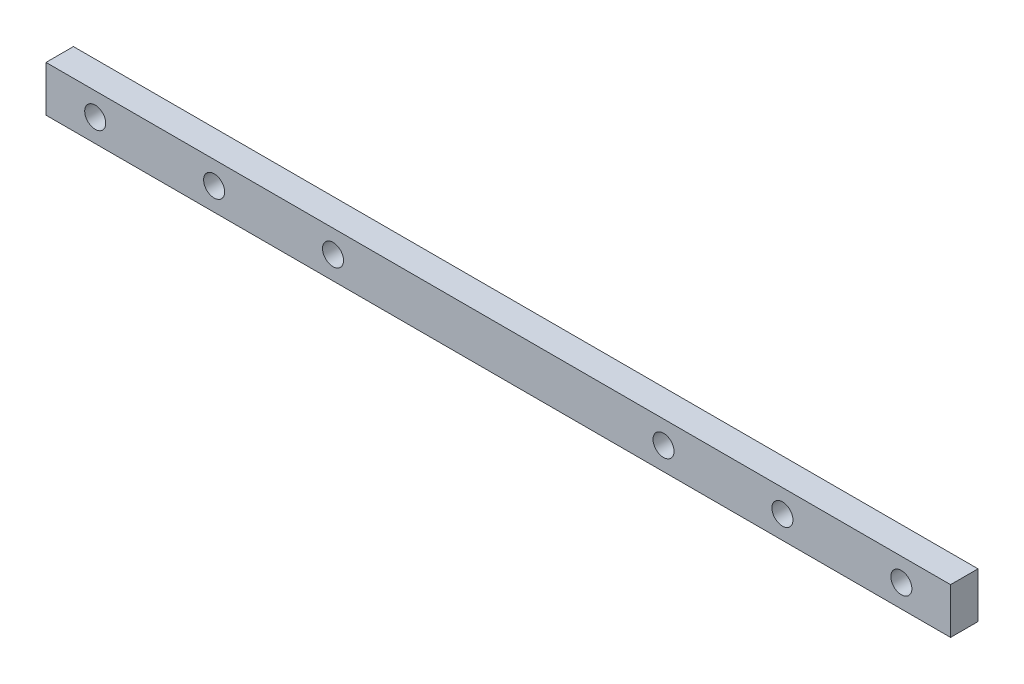
ISO-10303-21;
HEADER;
FILE_DESCRIPTION(('STEP AP214'),'2;1');
FILE_NAME('part.step','',(''),(''),'','','');
FILE_SCHEMA(('AUTOMOTIVE_DESIGN { 1 0 10303 214 1 1 1 1 }'));
ENDSEC;
DATA;
#1=APPLICATION_CONTEXT('core data for automotive mechanical design processes');
#2=APPLICATION_PROTOCOL_DEFINITION('international standard','automotive_design',2000,#1);
#3=PRODUCT_CONTEXT('',#1,'mechanical');
#4=PRODUCT('Part','Part','',(#3));
#5=PRODUCT_RELATED_PRODUCT_CATEGORY('part','',(#4));
#6=PRODUCT_DEFINITION_FORMATION('','',#4);
#7=PRODUCT_DEFINITION_CONTEXT('part definition',#1,'design');
#8=PRODUCT_DEFINITION('design','',#6,#7);
#9=PRODUCT_DEFINITION_SHAPE('','',#8);
#10=(LENGTH_UNIT() NAMED_UNIT(*) SI_UNIT(.MILLI.,.METRE.));
#11=(NAMED_UNIT(*) PLANE_ANGLE_UNIT() SI_UNIT($,.RADIAN.));
#12=(NAMED_UNIT(*) SI_UNIT($,.STERADIAN.) SOLID_ANGLE_UNIT());
#13=UNCERTAINTY_MEASURE_WITH_UNIT(LENGTH_MEASURE(1.E-05),#10,'distance_accuracy_value','');
#14=(GEOMETRIC_REPRESENTATION_CONTEXT(3) GLOBAL_UNCERTAINTY_ASSIGNED_CONTEXT((#13)) GLOBAL_UNIT_ASSIGNED_CONTEXT((#10,
#11,#12)) REPRESENTATION_CONTEXT('',''));
#15=CARTESIAN_POINT('',(0.,0.,0.));
#16=DIRECTION('',(0.,0.,1.));
#17=DIRECTION('',(1.,0.,0.));
#18=AXIS2_PLACEMENT_3D('',#15,#16,#17);
#19=CARTESIAN_POINT('',(-32.5,-20.885051312041,-14.0012634484264));
#20=DIRECTION('',(0.,-7.10399085631271E-05,0.999999997476666));
#21=DIRECTION('',(1.,0.,0.));
#22=AXIS2_PLACEMENT_3D('',#19,#20,#21);
#23=PLANE('',#22);
#24=CARTESIAN_POINT('',(-76.5679770448744,-20.885051312041,-14.0012634484264));
#25=DIRECTION('',(0.,7.10399085631271E-05,-0.999999997476666));
#26=DIRECTION('',(1.,0.,0.));
#27=AXIS2_PLACEMENT_3D('',#24,#25,#26);
#28=CIRCLE('',#27,1.15);
#29=CARTESIAN_POINT('',(-75.4179770448744,-20.885051312041,-14.0012634484264));
#30=VERTEX_POINT('',#29);
#31=EDGE_CURVE('E11',#30,#30,#28,.T.);
#32=ORIENTED_EDGE('',*,*,#31,.F.);
#33=EDGE_LOOP('',(#32));
#34=FACE_BOUND('',#33,.T.);
#35=CARTESIAN_POINT('',(-63.5679770448744,-20.885051312041,-14.0012634484264));
#36=DIRECTION('',(0.,7.10399085631271E-05,-0.999999997476666));
#37=DIRECTION('',(1.,0.,0.));
#38=AXIS2_PLACEMENT_3D('',#35,#36,#37);
#39=CIRCLE('',#38,1.15);
#40=CARTESIAN_POINT('',(-62.4179770448744,-20.885051312041,-14.0012634484264));
#41=VERTEX_POINT('',#40);
#42=EDGE_CURVE('E24',#41,#41,#39,.T.);
#43=ORIENTED_EDGE('',*,*,#42,.F.);
#44=EDGE_LOOP('',(#43));
#45=FACE_BOUND('',#44,.T.);
#46=CARTESIAN_POINT('',(-50.5679770448744,-20.885051312041,-14.0012634484264));
#47=DIRECTION('',(0.,7.10399085631271E-05,-0.999999997476666));
#48=DIRECTION('',(1.,0.,0.));
#49=AXIS2_PLACEMENT_3D('',#46,#47,#48);
#50=CIRCLE('',#49,1.15);
#51=CARTESIAN_POINT('',(-49.4179770448744,-20.885051312041,-14.0012634484264));
#52=VERTEX_POINT('',#51);
#53=EDGE_CURVE('E141',#52,#52,#50,.T.);
#54=ORIENTED_EDGE('',*,*,#53,.F.);
#55=EDGE_LOOP('',(#54));
#56=FACE_BOUND('',#55,.T.);
#57=CARTESIAN_POINT('',(11.5679770448743,-20.885051312041,-14.0012634484264));
#58=DIRECTION('',(0.,7.10399085631271E-05,-0.999999997476666));
#59=DIRECTION('',(1.,0.,0.));
#60=AXIS2_PLACEMENT_3D('',#57,#58,#59);
#61=CIRCLE('',#60,1.15);
#62=CARTESIAN_POINT('',(12.7179770448743,-20.885051312041,-14.0012634484264));
#63=VERTEX_POINT('',#62);
#64=EDGE_CURVE('E138',#63,#63,#61,.T.);
#65=ORIENTED_EDGE('',*,*,#64,.F.);
#66=EDGE_LOOP('',(#65));
#67=FACE_BOUND('',#66,.T.);
#68=CARTESIAN_POINT('',(-1.43202295512565,-20.885051312041,-14.0012634484264));
#69=DIRECTION('',(0.,7.10399085631271E-05,-0.999999997476666));
#70=DIRECTION('',(1.,0.,0.));
#71=AXIS2_PLACEMENT_3D('',#68,#69,#70);
#72=CIRCLE('',#71,1.15);
#73=CARTESIAN_POINT('',(-0.282022955125652,-20.885051312041,-14.0012634484264));
#74=VERTEX_POINT('',#73);
#75=EDGE_CURVE('E135',#74,#74,#72,.T.);
#76=ORIENTED_EDGE('',*,*,#75,.F.);
#77=EDGE_LOOP('',(#76));
#78=FACE_BOUND('',#77,.T.);
#79=CARTESIAN_POINT('',(-14.4320229551257,-20.885051312041,-14.0012634484264));
#80=DIRECTION('',(0.,7.10399085631271E-05,-0.999999997476666));
#81=DIRECTION('',(1.,0.,0.));
#82=AXIS2_PLACEMENT_3D('',#79,#80,#81);
#83=CIRCLE('',#82,1.15);
#84=CARTESIAN_POINT('',(-13.2820229551257,-20.885051312041,-14.0012634484264));
#85=VERTEX_POINT('',#84);
#86=EDGE_CURVE('E130',#85,#85,#83,.T.);
#87=ORIENTED_EDGE('',*,*,#86,.F.);
#88=EDGE_LOOP('',(#87));
#89=FACE_BOUND('',#88,.T.);
#90=DIRECTION('',(0.,-0.999999997476666,-7.10399085631271E-05));
#91=VECTOR('',#90,1.);
#92=CARTESIAN_POINT('',(-81.9499999776483,-18.3850513183523,-14.001085848655));
#93=LINE('',#92,#91);
#94=CARTESIAN_POINT('',(-81.9499999776483,-18.3850513183523,-14.001085848655));
#95=VERTEX_POINT('',#94);
#96=CARTESIAN_POINT('',(-81.9499999776483,-23.3850513057297,-14.0014410481978));
#97=VERTEX_POINT('',#96);
#98=EDGE_CURVE('E31',#95,#97,#93,.T.);
#99=ORIENTED_EDGE('',*,*,#98,.F.);
#100=DIRECTION('',(-1.,0.,0.));
#101=VECTOR('',#100,1.);
#102=CARTESIAN_POINT('',(16.9499999776483,-18.3850513183523,-14.001085848655));
#103=LINE('',#102,#101);
#104=CARTESIAN_POINT('',(16.9499999776483,-18.3850513183523,-14.001085848655));
#105=VERTEX_POINT('',#104);
#106=EDGE_CURVE('E36',#105,#95,#103,.T.);
#107=ORIENTED_EDGE('',*,*,#106,.F.);
#108=DIRECTION('',(0.,0.999999997476666,7.10399085620774E-05));
#109=VECTOR('',#108,1.);
#110=CARTESIAN_POINT('',(16.9499999776483,-23.3850513057296,-14.0014410481978));
#111=LINE('',#110,#109);
#112=CARTESIAN_POINT('',(16.9499999776483,-23.3850513057296,-14.0014410481978));
#113=VERTEX_POINT('',#112);
#114=EDGE_CURVE('E120',#113,#105,#111,.T.);
#115=ORIENTED_EDGE('',*,*,#114,.F.);
#116=DIRECTION('',(1.,0.,0.));
#117=VECTOR('',#116,1.);
#118=CARTESIAN_POINT('',(-81.9499999776483,-23.3850513057296,-14.0014410481978));
#119=LINE('',#118,#117);
#120=EDGE_CURVE('E117',#97,#113,#119,.T.);
#121=ORIENTED_EDGE('',*,*,#120,.F.);
#122=EDGE_LOOP('',(#99,#107,#115,#121));
#123=FACE_BOUND('',#122,.T.);
#124=ADVANCED_FACE('F17',(#34,#45,#56,#67,#78,#89,#123),#23,.F.);
#125=CARTESIAN_POINT('',(-32.5,-20.8852644317667,-11.0012634559964));
#126=DIRECTION('',(0.,-7.10399085631271E-05,0.999999997476666));
#127=DIRECTION('',(1.,0.,0.));
#128=AXIS2_PLACEMENT_3D('',#125,#126,#127);
#129=PLANE('',#128);
#130=CARTESIAN_POINT('',(-76.5679770448744,-20.8852644317667,-11.0012634559964));
#131=DIRECTION('',(0.,7.10399085631271E-05,-0.999999997476666));
#132=DIRECTION('',(1.,0.,0.));
#133=AXIS2_PLACEMENT_3D('',#130,#131,#132);
#134=CIRCLE('',#133,1.15);
#135=CARTESIAN_POINT('',(-75.4179770448744,-20.8852644317667,-11.0012634559964));
#136=VERTEX_POINT('',#135);
#137=EDGE_CURVE('E114',#136,#136,#134,.T.);
#138=ORIENTED_EDGE('',*,*,#137,.T.);
#139=EDGE_LOOP('',(#138));
#140=FACE_BOUND('',#139,.T.);
#141=CARTESIAN_POINT('',(-63.5679770448744,-20.8852644317667,-11.0012634559964));
#142=DIRECTION('',(0.,7.10399085631271E-05,-0.999999997476666));
#143=DIRECTION('',(1.,0.,0.));
#144=AXIS2_PLACEMENT_3D('',#141,#142,#143);
#145=CIRCLE('',#144,1.15);
#146=CARTESIAN_POINT('',(-62.4179770448744,-20.8852644317667,-11.0012634559964));
#147=VERTEX_POINT('',#146);
#148=EDGE_CURVE('E111',#147,#147,#145,.T.);
#149=ORIENTED_EDGE('',*,*,#148,.T.);
#150=EDGE_LOOP('',(#149));
#151=FACE_BOUND('',#150,.T.);
#152=CARTESIAN_POINT('',(-50.5679770448744,-20.8852644317667,-11.0012634559964));
#153=DIRECTION('',(0.,7.10399085631271E-05,-0.999999997476666));
#154=DIRECTION('',(1.,0.,0.));
#155=AXIS2_PLACEMENT_3D('',#152,#153,#154);
#156=CIRCLE('',#155,1.15);
#157=CARTESIAN_POINT('',(-49.4179770448744,-20.8852644317667,-11.0012634559964));
#158=VERTEX_POINT('',#157);
#159=EDGE_CURVE('E108',#158,#158,#156,.T.);
#160=ORIENTED_EDGE('',*,*,#159,.T.);
#161=EDGE_LOOP('',(#160));
#162=FACE_BOUND('',#161,.T.);
#163=CARTESIAN_POINT('',(11.5679770448743,-20.8852644317667,-11.0012634559964));
#164=DIRECTION('',(0.,7.10399085631271E-05,-0.999999997476666));
#165=DIRECTION('',(1.,0.,0.));
#166=AXIS2_PLACEMENT_3D('',#163,#164,#165);
#167=CIRCLE('',#166,1.15);
#168=CARTESIAN_POINT('',(12.7179770448743,-20.8852644317667,-11.0012634559964));
#169=VERTEX_POINT('',#168);
#170=EDGE_CURVE('E105',#169,#169,#167,.T.);
#171=ORIENTED_EDGE('',*,*,#170,.T.);
#172=EDGE_LOOP('',(#171));
#173=FACE_BOUND('',#172,.T.);
#174=CARTESIAN_POINT('',(-1.43202295512565,-20.8852644317667,-11.0012634559964));
#175=DIRECTION('',(0.,7.10399085631271E-05,-0.999999997476666));
#176=DIRECTION('',(1.,0.,0.));
#177=AXIS2_PLACEMENT_3D('',#174,#175,#176);
#178=CIRCLE('',#177,1.15);
#179=CARTESIAN_POINT('',(-0.28202295512565,-20.8852644317667,-11.0012634559964));
#180=VERTEX_POINT('',#179);
#181=EDGE_CURVE('E102',#180,#180,#178,.T.);
#182=ORIENTED_EDGE('',*,*,#181,.T.);
#183=EDGE_LOOP('',(#182));
#184=FACE_BOUND('',#183,.T.);
#185=CARTESIAN_POINT('',(-14.4320229551257,-20.8852644317667,-11.0012634559964));
#186=DIRECTION('',(0.,7.10399085631271E-05,-0.999999997476666));
#187=DIRECTION('',(1.,0.,0.));
#188=AXIS2_PLACEMENT_3D('',#185,#186,#187);
#189=CIRCLE('',#188,1.15);
#190=CARTESIAN_POINT('',(-13.2820229551257,-20.8852644317667,-11.0012634559964));
#191=VERTEX_POINT('',#190);
#192=EDGE_CURVE('E73',#191,#191,#189,.T.);
#193=ORIENTED_EDGE('',*,*,#192,.T.);
#194=EDGE_LOOP('',(#193));
#195=FACE_BOUND('',#194,.T.);
#196=DIRECTION('',(0.,-0.999999997476666,-7.10399085631271E-05));
#197=VECTOR('',#196,1.);
#198=CARTESIAN_POINT('',(-81.9499999776483,-18.385264438078,-11.001085856225));
#199=LINE('',#198,#197);
#200=CARTESIAN_POINT('',(-81.9499999776483,-18.385264438078,-11.001085856225));
#201=VERTEX_POINT('',#200);
#202=CARTESIAN_POINT('',(-81.9499999776483,-23.3852644254554,-11.0014410557678));
#203=VERTEX_POINT('',#202);
#204=EDGE_CURVE('E58',#201,#203,#199,.T.);
#205=ORIENTED_EDGE('',*,*,#204,.T.);
#206=DIRECTION('',(1.,0.,0.));
#207=VECTOR('',#206,1.);
#208=CARTESIAN_POINT('',(-81.9499999776483,-23.3852644254553,-11.0014410557678));
#209=LINE('',#208,#207);
#210=CARTESIAN_POINT('',(16.9499999776483,-23.3852644254553,-11.0014410557678));
#211=VERTEX_POINT('',#210);
#212=EDGE_CURVE('E74',#203,#211,#209,.T.);
#213=ORIENTED_EDGE('',*,*,#212,.T.);
#214=DIRECTION('',(0.,0.999999997476666,7.10399085620774E-05));
#215=VECTOR('',#214,1.);
#216=CARTESIAN_POINT('',(16.9499999776483,-23.3852644254553,-11.0014410557678));
#217=LINE('',#216,#215);
#218=CARTESIAN_POINT('',(16.9499999776483,-18.385264438078,-11.001085856225));
#219=VERTEX_POINT('',#218);
#220=EDGE_CURVE('E61',#211,#219,#217,.T.);
#221=ORIENTED_EDGE('',*,*,#220,.T.);
#222=DIRECTION('',(-1.,0.,0.));
#223=VECTOR('',#222,1.);
#224=CARTESIAN_POINT('',(16.9499999776483,-18.385264438078,-11.001085856225));
#225=LINE('',#224,#223);
#226=EDGE_CURVE('E55',#219,#201,#225,.T.);
#227=ORIENTED_EDGE('',*,*,#226,.T.);
#228=EDGE_LOOP('',(#205,#213,#221,#227));
#229=FACE_BOUND('',#228,.T.);
#230=ADVANCED_FACE('F57',(#140,#151,#162,#173,#184,#195,#229),#129,.T.);
#231=CARTESIAN_POINT('',(-81.9499999776483,-18.3850513183523,-14.001085848655));
#232=DIRECTION('',(-1.,0.,0.));
#233=DIRECTION('',(0.,-0.999999997476666,-7.10399085631271E-05));
#234=AXIS2_PLACEMENT_3D('',#231,#232,#233);
#235=PLANE('',#234);
#236=ORIENTED_EDGE('',*,*,#98,.T.);
#237=DIRECTION('',(0.,-7.10399085631271E-05,0.999999997476666));
#238=VECTOR('',#237,1.);
#239=CARTESIAN_POINT('',(-81.9499999776483,-23.3850513057297,-14.0014410481978));
#240=LINE('',#239,#238);
#241=EDGE_CURVE('E66',#97,#203,#240,.T.);
#242=ORIENTED_EDGE('',*,*,#241,.T.);
#243=ORIENTED_EDGE('',*,*,#204,.F.);
#244=DIRECTION('',(0.,-7.10399085631271E-05,0.999999997476666));
#245=VECTOR('',#244,1.);
#246=CARTESIAN_POINT('',(-81.9499999776483,-18.3850513183523,-14.001085848655));
#247=LINE('',#246,#245);
#248=EDGE_CURVE('E70',#95,#201,#247,.T.);
#249=ORIENTED_EDGE('',*,*,#248,.F.);
#250=EDGE_LOOP('',(#236,#242,#243,#249));
#251=FACE_BOUND('',#250,.T.);
#252=ADVANCED_FACE('F69',(#251),#235,.T.);
#253=CARTESIAN_POINT('',(-81.9499999776483,-23.3850513057296,-14.0014410481978));
#254=DIRECTION('',(0.,-0.999999997476666,-7.10399085631271E-05));
#255=DIRECTION('',(1.,0.,0.));
#256=AXIS2_PLACEMENT_3D('',#253,#254,#255);
#257=PLANE('',#256);
#258=ORIENTED_EDGE('',*,*,#120,.T.);
#259=DIRECTION('',(0.,-7.10399085631271E-05,0.999999997476666));
#260=VECTOR('',#259,1.);
#261=CARTESIAN_POINT('',(16.9499999776483,-23.3850513057296,-14.0014410481978));
#262=LINE('',#261,#260);
#263=EDGE_CURVE('E77',#113,#211,#262,.T.);
#264=ORIENTED_EDGE('',*,*,#263,.T.);
#265=ORIENTED_EDGE('',*,*,#212,.F.);
#266=ORIENTED_EDGE('',*,*,#241,.F.);
#267=EDGE_LOOP('',(#258,#264,#265,#266));
#268=FACE_BOUND('',#267,.T.);
#269=ADVANCED_FACE('F173',(#268),#257,.T.);
#270=CARTESIAN_POINT('',(16.9499999776483,-23.3850513057296,-14.0014410481978));
#271=DIRECTION('',(1.,0.,0.));
#272=DIRECTION('',(0.,0.999999997476666,7.10399085620774E-05));
#273=AXIS2_PLACEMENT_3D('',#270,#271,#272);
#274=PLANE('',#273);
#275=ORIENTED_EDGE('',*,*,#114,.T.);
#276=DIRECTION('',(0.,-7.10399085631271E-05,0.999999997476666));
#277=VECTOR('',#276,1.);
#278=CARTESIAN_POINT('',(16.9499999776483,-18.3850513183523,-14.001085848655));
#279=LINE('',#278,#277);
#280=EDGE_CURVE('E81',#105,#219,#279,.T.);
#281=ORIENTED_EDGE('',*,*,#280,.T.);
#282=ORIENTED_EDGE('',*,*,#220,.F.);
#283=ORIENTED_EDGE('',*,*,#263,.F.);
#284=EDGE_LOOP('',(#275,#281,#282,#283));
#285=FACE_BOUND('',#284,.T.);
#286=ADVANCED_FACE('F179',(#285),#274,.T.);
#287=CARTESIAN_POINT('',(16.9499999776483,-18.3850513183523,-14.001085848655));
#288=DIRECTION('',(0.,0.999999997476666,7.10399085631271E-05));
#289=DIRECTION('',(-1.,0.,0.));
#290=AXIS2_PLACEMENT_3D('',#287,#288,#289);
#291=PLANE('',#290);
#292=ORIENTED_EDGE('',*,*,#106,.T.);
#293=ORIENTED_EDGE('',*,*,#248,.T.);
#294=ORIENTED_EDGE('',*,*,#226,.F.);
#295=ORIENTED_EDGE('',*,*,#280,.F.);
#296=EDGE_LOOP('',(#292,#293,#294,#295));
#297=FACE_BOUND('',#296,.T.);
#298=ADVANCED_FACE('F76',(#297),#291,.T.);
#299=CARTESIAN_POINT('',(-14.4320229551257,-20.885051312041,-14.0012634484264));
#300=DIRECTION('',(0.,-7.10399085631271E-05,0.999999997476666));
#301=DIRECTION('',(1.,0.,0.));
#302=AXIS2_PLACEMENT_3D('',#299,#300,#301);
#303=CYLINDRICAL_SURFACE('',#302,1.15);
#304=ORIENTED_EDGE('',*,*,#86,.T.);
#305=EDGE_LOOP('',(#304));
#306=FACE_BOUND('',#305,.T.);
#307=ORIENTED_EDGE('',*,*,#192,.F.);
#308=EDGE_LOOP('',(#307));
#309=FACE_BOUND('',#308,.T.);
#310=ADVANCED_FACE('F160',(#306,#309),#303,.F.);
#311=CARTESIAN_POINT('',(-1.43202295512565,-20.885051312041,-14.0012634484264));
#312=DIRECTION('',(0.,-7.10399085631271E-05,0.999999997476666));
#313=DIRECTION('',(1.,0.,0.));
#314=AXIS2_PLACEMENT_3D('',#311,#312,#313);
#315=CYLINDRICAL_SURFACE('',#314,1.15);
#316=ORIENTED_EDGE('',*,*,#75,.T.);
#317=EDGE_LOOP('',(#316));
#318=FACE_BOUND('',#317,.T.);
#319=ORIENTED_EDGE('',*,*,#181,.F.);
#320=EDGE_LOOP('',(#319));
#321=FACE_BOUND('',#320,.T.);
#322=ADVANCED_FACE('F163',(#318,#321),#315,.F.);
#323=CARTESIAN_POINT('',(11.5679770448743,-20.885051312041,-14.0012634484264));
#324=DIRECTION('',(0.,-7.10399085631271E-05,0.999999997476666));
#325=DIRECTION('',(1.,0.,0.));
#326=AXIS2_PLACEMENT_3D('',#323,#324,#325);
#327=CYLINDRICAL_SURFACE('',#326,1.15);
#328=ORIENTED_EDGE('',*,*,#64,.T.);
#329=EDGE_LOOP('',(#328));
#330=FACE_BOUND('',#329,.T.);
#331=ORIENTED_EDGE('',*,*,#170,.F.);
#332=EDGE_LOOP('',(#331));
#333=FACE_BOUND('',#332,.T.);
#334=ADVANCED_FACE('F188',(#330,#333),#327,.F.);
#335=CARTESIAN_POINT('',(-50.5679770448744,-20.885051312041,-14.0012634484264));
#336=DIRECTION('',(0.,-7.10399085631271E-05,0.999999997476666));
#337=DIRECTION('',(1.,0.,0.));
#338=AXIS2_PLACEMENT_3D('',#335,#336,#337);
#339=CYLINDRICAL_SURFACE('',#338,1.15);
#340=ORIENTED_EDGE('',*,*,#53,.T.);
#341=EDGE_LOOP('',(#340));
#342=FACE_BOUND('',#341,.T.);
#343=ORIENTED_EDGE('',*,*,#159,.F.);
#344=EDGE_LOOP('',(#343));
#345=FACE_BOUND('',#344,.T.);
#346=ADVANCED_FACE('F192',(#342,#345),#339,.F.);
#347=CARTESIAN_POINT('',(-63.5679770448744,-20.885051312041,-14.0012634484264));
#348=DIRECTION('',(0.,-7.10399085631271E-05,0.999999997476666));
#349=DIRECTION('',(1.,0.,0.));
#350=AXIS2_PLACEMENT_3D('',#347,#348,#349);
#351=CYLINDRICAL_SURFACE('',#350,1.15);
#352=ORIENTED_EDGE('',*,*,#42,.T.);
#353=EDGE_LOOP('',(#352));
#354=FACE_BOUND('',#353,.T.);
#355=ORIENTED_EDGE('',*,*,#148,.F.);
#356=EDGE_LOOP('',(#355));
#357=FACE_BOUND('',#356,.T.);
#358=ADVANCED_FACE('F146',(#354,#357),#351,.F.);
#359=CARTESIAN_POINT('',(-76.5679770448744,-20.885051312041,-14.0012634484264));
#360=DIRECTION('',(0.,-7.10399085631271E-05,0.999999997476666));
#361=DIRECTION('',(1.,0.,0.));
#362=AXIS2_PLACEMENT_3D('',#359,#360,#361);
#363=CYLINDRICAL_SURFACE('',#362,1.15);
#364=ORIENTED_EDGE('',*,*,#31,.T.);
#365=EDGE_LOOP('',(#364));
#366=FACE_BOUND('',#365,.T.);
#367=ORIENTED_EDGE('',*,*,#137,.F.);
#368=EDGE_LOOP('',(#367));
#369=FACE_BOUND('',#368,.T.);
#370=ADVANCED_FACE('F199',(#366,#369),#363,.F.);
#371=CLOSED_SHELL('',(#124,#230,#252,#269,#286,#298,#310,#322,#334,#346,#358,#370));
#372=MANIFOLD_SOLID_BREP('B1',#371);
#373=ADVANCED_BREP_SHAPE_REPRESENTATION('',(#18,#372),#14);
#374=SHAPE_DEFINITION_REPRESENTATION(#9,#373);
ENDSEC;
END-ISO-10303-21;
